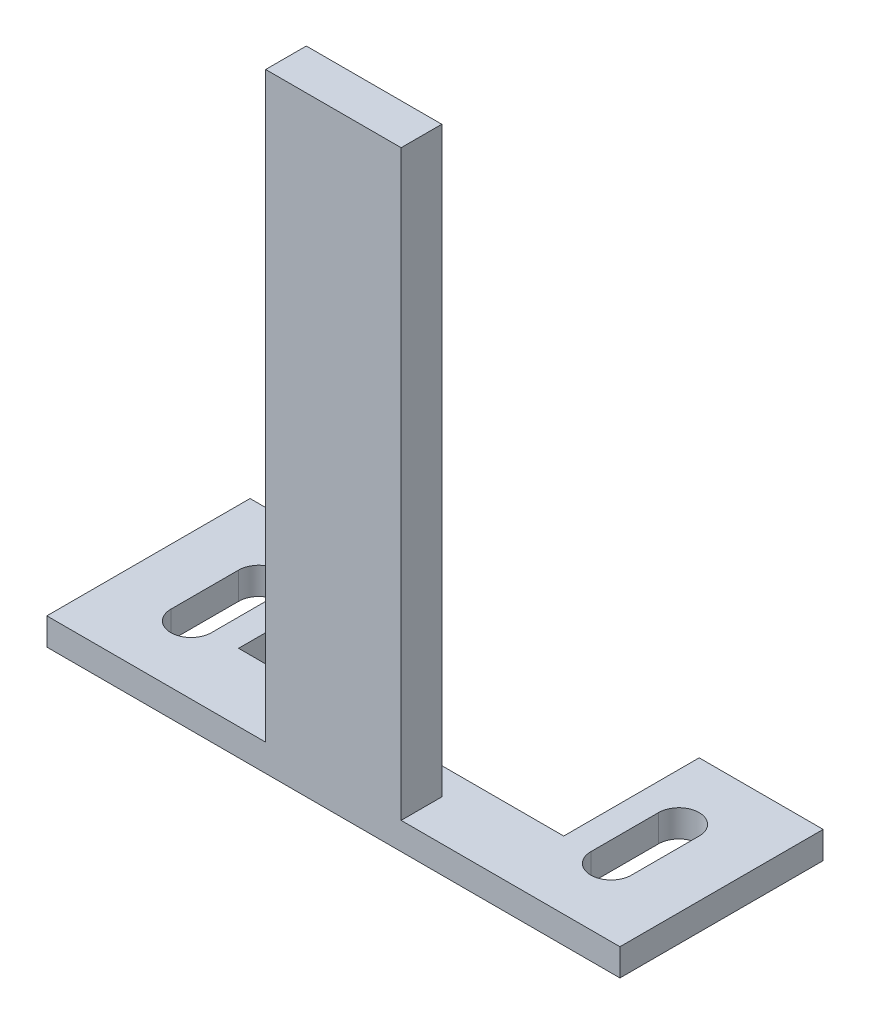
ISO-10303-21;
HEADER;
FILE_DESCRIPTION(('STEP AP214'),'2;1');
FILE_NAME('part.step','',(''),(''),'','','');
FILE_SCHEMA(('AUTOMOTIVE_DESIGN { 1 0 10303 214 1 1 1 1 }'));
ENDSEC;
DATA;
#1=APPLICATION_CONTEXT('core data for automotive mechanical design processes');
#2=APPLICATION_PROTOCOL_DEFINITION('international standard','automotive_design',2000,#1);
#3=PRODUCT_CONTEXT('',#1,'mechanical');
#4=PRODUCT('Part','Part','',(#3));
#5=PRODUCT_RELATED_PRODUCT_CATEGORY('part','',(#4));
#6=PRODUCT_DEFINITION_FORMATION('','',#4);
#7=PRODUCT_DEFINITION_CONTEXT('part definition',#1,'design');
#8=PRODUCT_DEFINITION('design','',#6,#7);
#9=PRODUCT_DEFINITION_SHAPE('','',#8);
#10=(LENGTH_UNIT() NAMED_UNIT(*) SI_UNIT(.MILLI.,.METRE.));
#11=(NAMED_UNIT(*) PLANE_ANGLE_UNIT() SI_UNIT($,.RADIAN.));
#12=(NAMED_UNIT(*) SI_UNIT($,.STERADIAN.) SOLID_ANGLE_UNIT());
#13=UNCERTAINTY_MEASURE_WITH_UNIT(LENGTH_MEASURE(1.E-05),#10,'distance_accuracy_value','');
#14=(GEOMETRIC_REPRESENTATION_CONTEXT(3) GLOBAL_UNCERTAINTY_ASSIGNED_CONTEXT((#13)) GLOBAL_UNIT_ASSIGNED_CONTEXT((#10,
#11,#12)) REPRESENTATION_CONTEXT('',''));
#15=CARTESIAN_POINT('',(0.,0.,0.));
#16=DIRECTION('',(0.,0.,1.));
#17=DIRECTION('',(1.,0.,0.));
#18=AXIS2_PLACEMENT_3D('',#15,#16,#17);
#19=CARTESIAN_POINT('',(0.,2.,0.));
#20=DIRECTION('',(0.,1.,0.));
#21=DIRECTION('',(0.,0.,1.));
#22=AXIS2_PLACEMENT_3D('',#19,#20,#21);
#23=PLANE('',#22);
#24=DIRECTION('',(0.,0.,-1.));
#25=VECTOR('',#24,1.);
#26=CARTESIAN_POINT('',(5.,2.,0.));
#27=LINE('',#26,#25);
#28=CARTESIAN_POINT('',(5.,2.,7.5));
#29=VERTEX_POINT('',#28);
#30=CARTESIAN_POINT('',(5.,2.,4.5));
#31=VERTEX_POINT('',#30);
#32=EDGE_CURVE('E182',#29,#31,#27,.T.);
#33=ORIENTED_EDGE('',*,*,#32,.F.);
#34=DIRECTION('',(1.,0.,0.));
#35=VECTOR('',#34,1.);
#36=CARTESIAN_POINT('',(-21.15,2.,7.5));
#37=LINE('',#36,#35);
#38=CARTESIAN_POINT('',(21.15,2.,7.5));
#39=VERTEX_POINT('',#38);
#40=EDGE_CURVE('E332',#29,#39,#37,.T.);
#41=ORIENTED_EDGE('',*,*,#40,.T.);
#42=DIRECTION('',(0.,0.,-1.));
#43=VECTOR('',#42,1.);
#44=CARTESIAN_POINT('',(21.15,2.,-7.5));
#45=LINE('',#44,#43);
#46=CARTESIAN_POINT('',(21.15,2.,-7.5));
#47=VERTEX_POINT('',#46);
#48=EDGE_CURVE('E309',#39,#47,#45,.T.);
#49=ORIENTED_EDGE('',*,*,#48,.T.);
#50=DIRECTION('',(-1.,0.,0.));
#51=VECTOR('',#50,1.);
#52=CARTESIAN_POINT('',(12.,2.,-7.5));
#53=LINE('',#52,#51);
#54=CARTESIAN_POINT('',(12.,2.,-7.5));
#55=VERTEX_POINT('',#54);
#56=EDGE_CURVE('E313',#47,#55,#53,.T.);
#57=ORIENTED_EDGE('',*,*,#56,.T.);
#58=DIRECTION('',(0.,0.,1.));
#59=VECTOR('',#58,1.);
#60=CARTESIAN_POINT('',(12.,2.,-7.5));
#61=LINE('',#60,#59);
#62=CARTESIAN_POINT('',(12.,2.,2.49999999999999));
#63=VERTEX_POINT('',#62);
#64=EDGE_CURVE('E317',#55,#63,#61,.T.);
#65=ORIENTED_EDGE('',*,*,#64,.T.);
#66=DIRECTION('',(-1.,0.,0.));
#67=VECTOR('',#66,1.);
#68=CARTESIAN_POINT('',(12.,2.,2.49999999999999));
#69=LINE('',#68,#67);
#70=CARTESIAN_POINT('',(-12.,2.,2.49999999999999));
#71=VERTEX_POINT('',#70);
#72=EDGE_CURVE('E320',#63,#71,#69,.T.);
#73=ORIENTED_EDGE('',*,*,#72,.T.);
#74=DIRECTION('',(0.,0.,-1.));
#75=VECTOR('',#74,1.);
#76=CARTESIAN_POINT('',(-12.,2.,2.49999999999999));
#77=LINE('',#76,#75);
#78=CARTESIAN_POINT('',(-12.,2.,-7.5));
#79=VERTEX_POINT('',#78);
#80=EDGE_CURVE('E323',#71,#79,#77,.T.);
#81=ORIENTED_EDGE('',*,*,#80,.T.);
#82=DIRECTION('',(-1.,0.,0.));
#83=VECTOR('',#82,1.);
#84=CARTESIAN_POINT('',(-21.15,2.,-7.5));
#85=LINE('',#84,#83);
#86=CARTESIAN_POINT('',(-21.15,2.,-7.5));
#87=VERTEX_POINT('',#86);
#88=EDGE_CURVE('E326',#79,#87,#85,.T.);
#89=ORIENTED_EDGE('',*,*,#88,.T.);
#90=DIRECTION('',(0.,0.,1.));
#91=VECTOR('',#90,1.);
#92=CARTESIAN_POINT('',(-21.15,2.,-7.5));
#93=LINE('',#92,#91);
#94=CARTESIAN_POINT('',(-21.15,2.,7.5));
#95=VERTEX_POINT('',#94);
#96=EDGE_CURVE('E329',#87,#95,#93,.T.);
#97=ORIENTED_EDGE('',*,*,#96,.T.);
#98=CARTESIAN_POINT('',(-5.,2.,7.5));
#99=VERTEX_POINT('',#98);
#100=EDGE_CURVE('E333',#95,#99,#37,.T.);
#101=ORIENTED_EDGE('',*,*,#100,.T.);
#102=DIRECTION('',(0.,0.,1.));
#103=VECTOR('',#102,1.);
#104=CARTESIAN_POINT('',(-5.,2.,0.));
#105=LINE('',#104,#103);
#106=CARTESIAN_POINT('',(-5.,2.,4.5));
#107=VERTEX_POINT('',#106);
#108=EDGE_CURVE('E60',#107,#99,#105,.T.);
#109=ORIENTED_EDGE('',*,*,#108,.F.);
#110=DIRECTION('',(1.,0.,0.));
#111=VECTOR('',#110,1.);
#112=CARTESIAN_POINT('',(0.,2.,4.5));
#113=LINE('',#112,#111);
#114=EDGE_CURVE('E55',#107,#31,#113,.T.);
#115=ORIENTED_EDGE('',*,*,#114,.T.);
#116=EDGE_LOOP('',(#33,#41,#49,#57,#65,#73,#81,#89,#97,#101,#109,#115));
#117=FACE_BOUND('',#116,.T.);
#118=DIRECTION('',(0.,0.,1.));
#119=VECTOR('',#118,1.);
#120=CARTESIAN_POINT('',(-17.,2.,-2.5));
#121=LINE('',#120,#119);
#122=CARTESIAN_POINT('',(-17.,2.,-2.5));
#123=VERTEX_POINT('',#122);
#124=CARTESIAN_POINT('',(-17.,2.,2.49999999999999));
#125=VERTEX_POINT('',#124);
#126=EDGE_CURVE('E269',#123,#125,#121,.T.);
#127=ORIENTED_EDGE('',*,*,#126,.F.);
#128=CARTESIAN_POINT('',(-15.5,2.,-2.5));
#129=DIRECTION('',(0.,1.,0.));
#130=DIRECTION('',(0.,0.,1.));
#131=AXIS2_PLACEMENT_3D('',#128,#129,#130);
#132=CIRCLE('',#131,1.5);
#133=CARTESIAN_POINT('',(-14.,2.,-2.5));
#134=VERTEX_POINT('',#133);
#135=EDGE_CURVE('E266',#134,#123,#132,.T.);
#136=ORIENTED_EDGE('',*,*,#135,.F.);
#137=DIRECTION('',(0.,0.,-1.));
#138=VECTOR('',#137,1.);
#139=CARTESIAN_POINT('',(-14.,2.,-2.5));
#140=LINE('',#139,#138);
#141=CARTESIAN_POINT('',(-14.,2.,2.49999999999999));
#142=VERTEX_POINT('',#141);
#143=EDGE_CURVE('E277',#142,#134,#140,.T.);
#144=ORIENTED_EDGE('',*,*,#143,.F.);
#145=CARTESIAN_POINT('',(-15.5,2.,2.49999999999999));
#146=DIRECTION('',(0.,1.,0.));
#147=DIRECTION('',(0.,0.,1.));
#148=AXIS2_PLACEMENT_3D('',#145,#146,#147);
#149=CIRCLE('',#148,1.5);
#150=EDGE_CURVE('E273',#125,#142,#149,.T.);
#151=ORIENTED_EDGE('',*,*,#150,.F.);
#152=EDGE_LOOP('',(#127,#136,#144,#151));
#153=FACE_BOUND('',#152,.T.);
#154=DIRECTION('',(0.,0.,1.));
#155=VECTOR('',#154,1.);
#156=CARTESIAN_POINT('',(14.,2.,-2.5));
#157=LINE('',#156,#155);
#158=CARTESIAN_POINT('',(14.,2.,-2.5));
#159=VERTEX_POINT('',#158);
#160=CARTESIAN_POINT('',(14.,2.,2.49999999999999));
#161=VERTEX_POINT('',#160);
#162=EDGE_CURVE('E226',#159,#161,#157,.T.);
#163=ORIENTED_EDGE('',*,*,#162,.F.);
#164=CARTESIAN_POINT('',(15.5,2.,-2.5));
#165=DIRECTION('',(0.,1.,0.));
#166=DIRECTION('',(0.,0.,1.));
#167=AXIS2_PLACEMENT_3D('',#164,#165,#166);
#168=CIRCLE('',#167,1.5);
#169=CARTESIAN_POINT('',(17.,2.,-2.5));
#170=VERTEX_POINT('',#169);
#171=EDGE_CURVE('E223',#170,#159,#168,.T.);
#172=ORIENTED_EDGE('',*,*,#171,.F.);
#173=DIRECTION('',(0.,0.,-1.));
#174=VECTOR('',#173,1.);
#175=CARTESIAN_POINT('',(17.,2.,-2.5));
#176=LINE('',#175,#174);
#177=CARTESIAN_POINT('',(17.,2.,2.49999999999999));
#178=VERTEX_POINT('',#177);
#179=EDGE_CURVE('E234',#178,#170,#176,.T.);
#180=ORIENTED_EDGE('',*,*,#179,.F.);
#181=CARTESIAN_POINT('',(15.5,2.,2.49999999999999));
#182=DIRECTION('',(0.,1.,0.));
#183=DIRECTION('',(0.,0.,1.));
#184=AXIS2_PLACEMENT_3D('',#181,#182,#183);
#185=CIRCLE('',#184,1.5);
#186=EDGE_CURVE('E230',#161,#178,#185,.T.);
#187=ORIENTED_EDGE('',*,*,#186,.F.);
#188=EDGE_LOOP('',(#163,#172,#180,#187));
#189=FACE_BOUND('',#188,.T.);
#190=ADVANCED_FACE('F39',(#117,#153,#189),#23,.T.);
#191=CARTESIAN_POINT('',(0.,0.,0.));
#192=DIRECTION('',(0.,1.,0.));
#193=DIRECTION('',(0.,0.,1.));
#194=AXIS2_PLACEMENT_3D('',#191,#192,#193);
#195=PLANE('',#194);
#196=DIRECTION('',(0.,0.,-1.));
#197=VECTOR('',#196,1.);
#198=CARTESIAN_POINT('',(21.15,0.,-7.5));
#199=LINE('',#198,#197);
#200=CARTESIAN_POINT('',(21.15,0.,7.5));
#201=VERTEX_POINT('',#200);
#202=CARTESIAN_POINT('',(21.15,0.,-7.5));
#203=VERTEX_POINT('',#202);
#204=EDGE_CURVE('E308',#201,#203,#199,.T.);
#205=ORIENTED_EDGE('',*,*,#204,.F.);
#206=DIRECTION('',(1.,0.,0.));
#207=VECTOR('',#206,1.);
#208=CARTESIAN_POINT('',(-21.15,0.,7.5));
#209=LINE('',#208,#207);
#210=CARTESIAN_POINT('',(-21.15,0.,7.5));
#211=VERTEX_POINT('',#210);
#212=EDGE_CURVE('E314',#211,#201,#209,.T.);
#213=ORIENTED_EDGE('',*,*,#212,.F.);
#214=DIRECTION('',(0.,0.,1.));
#215=VECTOR('',#214,1.);
#216=CARTESIAN_POINT('',(-21.15,0.,-7.5));
#217=LINE('',#216,#215);
#218=CARTESIAN_POINT('',(-21.15,0.,-7.5));
#219=VERTEX_POINT('',#218);
#220=EDGE_CURVE('E355',#219,#211,#217,.T.);
#221=ORIENTED_EDGE('',*,*,#220,.F.);
#222=DIRECTION('',(-1.,0.,0.));
#223=VECTOR('',#222,1.);
#224=CARTESIAN_POINT('',(-21.15,0.,-7.5));
#225=LINE('',#224,#223);
#226=CARTESIAN_POINT('',(-12.,0.,-7.5));
#227=VERTEX_POINT('',#226);
#228=EDGE_CURVE('E352',#227,#219,#225,.T.);
#229=ORIENTED_EDGE('',*,*,#228,.F.);
#230=DIRECTION('',(0.,0.,-1.));
#231=VECTOR('',#230,1.);
#232=CARTESIAN_POINT('',(-12.,0.,2.49999999999999));
#233=LINE('',#232,#231);
#234=CARTESIAN_POINT('',(-12.,0.,2.49999999999999));
#235=VERTEX_POINT('',#234);
#236=EDGE_CURVE('E349',#235,#227,#233,.T.);
#237=ORIENTED_EDGE('',*,*,#236,.F.);
#238=DIRECTION('',(-1.,0.,0.));
#239=VECTOR('',#238,1.);
#240=CARTESIAN_POINT('',(12.,0.,2.49999999999999));
#241=LINE('',#240,#239);
#242=CARTESIAN_POINT('',(12.,0.,2.49999999999999));
#243=VERTEX_POINT('',#242);
#244=EDGE_CURVE('E346',#243,#235,#241,.T.);
#245=ORIENTED_EDGE('',*,*,#244,.F.);
#246=DIRECTION('',(0.,0.,1.));
#247=VECTOR('',#246,1.);
#248=CARTESIAN_POINT('',(12.,0.,-7.5));
#249=LINE('',#248,#247);
#250=CARTESIAN_POINT('',(12.,0.,-7.5));
#251=VERTEX_POINT('',#250);
#252=EDGE_CURVE('E343',#251,#243,#249,.T.);
#253=ORIENTED_EDGE('',*,*,#252,.F.);
#254=DIRECTION('',(-1.,0.,0.));
#255=VECTOR('',#254,1.);
#256=CARTESIAN_POINT('',(12.,0.,-7.5));
#257=LINE('',#256,#255);
#258=EDGE_CURVE('E340',#203,#251,#257,.T.);
#259=ORIENTED_EDGE('',*,*,#258,.F.);
#260=EDGE_LOOP('',(#205,#213,#221,#229,#237,#245,#253,#259));
#261=FACE_BOUND('',#260,.T.);
#262=CARTESIAN_POINT('',(-15.5,0.,-2.5));
#263=DIRECTION('',(0.,1.,0.));
#264=DIRECTION('',(0.,0.,1.));
#265=AXIS2_PLACEMENT_3D('',#262,#263,#264);
#266=CIRCLE('',#265,1.5);
#267=CARTESIAN_POINT('',(-14.,0.,-2.5));
#268=VERTEX_POINT('',#267);
#269=CARTESIAN_POINT('',(-17.,0.,-2.5));
#270=VERTEX_POINT('',#269);
#271=EDGE_CURVE('E265',#268,#270,#266,.T.);
#272=ORIENTED_EDGE('',*,*,#271,.T.);
#273=DIRECTION('',(0.,0.,1.));
#274=VECTOR('',#273,1.);
#275=CARTESIAN_POINT('',(-17.,0.,-2.5));
#276=LINE('',#275,#274);
#277=CARTESIAN_POINT('',(-17.,0.,2.49999999999999));
#278=VERTEX_POINT('',#277);
#279=EDGE_CURVE('E284',#270,#278,#276,.T.);
#280=ORIENTED_EDGE('',*,*,#279,.T.);
#281=CARTESIAN_POINT('',(-15.5,0.,2.49999999999999));
#282=DIRECTION('',(0.,1.,0.));
#283=DIRECTION('',(0.,0.,1.));
#284=AXIS2_PLACEMENT_3D('',#281,#282,#283);
#285=CIRCLE('',#284,1.5);
#286=CARTESIAN_POINT('',(-14.,0.,2.49999999999999));
#287=VERTEX_POINT('',#286);
#288=EDGE_CURVE('E288',#278,#287,#285,.T.);
#289=ORIENTED_EDGE('',*,*,#288,.T.);
#290=DIRECTION('',(0.,0.,-1.));
#291=VECTOR('',#290,1.);
#292=CARTESIAN_POINT('',(-14.,0.,-2.5));
#293=LINE('',#292,#291);
#294=EDGE_CURVE('E270',#287,#268,#293,.T.);
#295=ORIENTED_EDGE('',*,*,#294,.T.);
#296=EDGE_LOOP('',(#272,#280,#289,#295));
#297=FACE_BOUND('',#296,.T.);
#298=CARTESIAN_POINT('',(15.5,0.,-2.5));
#299=DIRECTION('',(0.,1.,0.));
#300=DIRECTION('',(0.,0.,1.));
#301=AXIS2_PLACEMENT_3D('',#298,#299,#300);
#302=CIRCLE('',#301,1.5);
#303=CARTESIAN_POINT('',(17.,0.,-2.5));
#304=VERTEX_POINT('',#303);
#305=CARTESIAN_POINT('',(14.,0.,-2.5));
#306=VERTEX_POINT('',#305);
#307=EDGE_CURVE('E222',#304,#306,#302,.T.);
#308=ORIENTED_EDGE('',*,*,#307,.T.);
#309=DIRECTION('',(0.,0.,1.));
#310=VECTOR('',#309,1.);
#311=CARTESIAN_POINT('',(14.,0.,-2.5));
#312=LINE('',#311,#310);
#313=CARTESIAN_POINT('',(14.,0.,2.49999999999999));
#314=VERTEX_POINT('',#313);
#315=EDGE_CURVE('E241',#306,#314,#312,.T.);
#316=ORIENTED_EDGE('',*,*,#315,.T.);
#317=CARTESIAN_POINT('',(15.5,0.,2.49999999999999));
#318=DIRECTION('',(0.,1.,0.));
#319=DIRECTION('',(0.,0.,1.));
#320=AXIS2_PLACEMENT_3D('',#317,#318,#319);
#321=CIRCLE('',#320,1.5);
#322=CARTESIAN_POINT('',(17.,0.,2.49999999999999));
#323=VERTEX_POINT('',#322);
#324=EDGE_CURVE('E245',#314,#323,#321,.T.);
#325=ORIENTED_EDGE('',*,*,#324,.T.);
#326=DIRECTION('',(0.,0.,-1.));
#327=VECTOR('',#326,1.);
#328=CARTESIAN_POINT('',(17.,0.,-2.5));
#329=LINE('',#328,#327);
#330=EDGE_CURVE('E227',#323,#304,#329,.T.);
#331=ORIENTED_EDGE('',*,*,#330,.T.);
#332=EDGE_LOOP('',(#308,#316,#325,#331));
#333=FACE_BOUND('',#332,.T.);
#334=ADVANCED_FACE('F394',(#261,#297,#333),#195,.F.);
#335=CARTESIAN_POINT('',(21.15,2.,-7.5));
#336=DIRECTION('',(-1.,0.,0.));
#337=DIRECTION('',(0.,0.,1.));
#338=AXIS2_PLACEMENT_3D('',#335,#336,#337);
#339=PLANE('',#338);
#340=ORIENTED_EDGE('',*,*,#204,.T.);
#341=DIRECTION('',(0.,-1.,0.));
#342=VECTOR('',#341,1.);
#343=CARTESIAN_POINT('',(21.15,2.,-7.5));
#344=LINE('',#343,#342);
#345=EDGE_CURVE('E11',#47,#203,#344,.T.);
#346=ORIENTED_EDGE('',*,*,#345,.F.);
#347=ORIENTED_EDGE('',*,*,#48,.F.);
#348=DIRECTION('',(0.,-1.,0.));
#349=VECTOR('',#348,1.);
#350=CARTESIAN_POINT('',(21.15,2.,7.5));
#351=LINE('',#350,#349);
#352=EDGE_CURVE('E336',#39,#201,#351,.T.);
#353=ORIENTED_EDGE('',*,*,#352,.T.);
#354=EDGE_LOOP('',(#340,#346,#347,#353));
#355=FACE_BOUND('',#354,.T.);
#356=ADVANCED_FACE('F41',(#355),#339,.F.);
#357=CARTESIAN_POINT('',(12.,2.,-7.5));
#358=DIRECTION('',(0.,0.,1.));
#359=DIRECTION('',(1.,0.,0.));
#360=AXIS2_PLACEMENT_3D('',#357,#358,#359);
#361=PLANE('',#360);
#362=ORIENTED_EDGE('',*,*,#258,.T.);
#363=DIRECTION('',(0.,-1.,0.));
#364=VECTOR('',#363,1.);
#365=CARTESIAN_POINT('',(12.,2.,-7.5));
#366=LINE('',#365,#364);
#367=EDGE_CURVE('E48',#55,#251,#366,.T.);
#368=ORIENTED_EDGE('',*,*,#367,.F.);
#369=ORIENTED_EDGE('',*,*,#56,.F.);
#370=ORIENTED_EDGE('',*,*,#345,.T.);
#371=EDGE_LOOP('',(#362,#368,#369,#370));
#372=FACE_BOUND('',#371,.T.);
#373=ADVANCED_FACE('F411',(#372),#361,.F.);
#374=CARTESIAN_POINT('',(12.,2.,-7.5));
#375=DIRECTION('',(1.,0.,0.));
#376=DIRECTION('',(0.,0.,-1.));
#377=AXIS2_PLACEMENT_3D('',#374,#375,#376);
#378=PLANE('',#377);
#379=ORIENTED_EDGE('',*,*,#252,.T.);
#380=DIRECTION('',(0.,-1.,0.));
#381=VECTOR('',#380,1.);
#382=CARTESIAN_POINT('',(12.,2.,2.49999999999999));
#383=LINE('',#382,#381);
#384=EDGE_CURVE('E379',#63,#243,#383,.T.);
#385=ORIENTED_EDGE('',*,*,#384,.F.);
#386=ORIENTED_EDGE('',*,*,#64,.F.);
#387=ORIENTED_EDGE('',*,*,#367,.T.);
#388=EDGE_LOOP('',(#379,#385,#386,#387));
#389=FACE_BOUND('',#388,.T.);
#390=ADVANCED_FACE('F388',(#389),#378,.F.);
#391=CARTESIAN_POINT('',(12.,2.,2.49999999999999));
#392=DIRECTION('',(0.,0.,1.));
#393=DIRECTION('',(1.,0.,0.));
#394=AXIS2_PLACEMENT_3D('',#391,#392,#393);
#395=PLANE('',#394);
#396=ORIENTED_EDGE('',*,*,#244,.T.);
#397=DIRECTION('',(0.,-1.,0.));
#398=VECTOR('',#397,1.);
#399=CARTESIAN_POINT('',(-12.,2.,2.49999999999999));
#400=LINE('',#399,#398);
#401=EDGE_CURVE('E375',#71,#235,#400,.T.);
#402=ORIENTED_EDGE('',*,*,#401,.F.);
#403=ORIENTED_EDGE('',*,*,#72,.F.);
#404=ORIENTED_EDGE('',*,*,#384,.T.);
#405=EDGE_LOOP('',(#396,#402,#403,#404));
#406=FACE_BOUND('',#405,.T.);
#407=ADVANCED_FACE('F400',(#406),#395,.F.);
#408=CARTESIAN_POINT('',(-12.,2.,2.49999999999999));
#409=DIRECTION('',(-1.,0.,0.));
#410=DIRECTION('',(0.,0.,1.));
#411=AXIS2_PLACEMENT_3D('',#408,#409,#410);
#412=PLANE('',#411);
#413=ORIENTED_EDGE('',*,*,#236,.T.);
#414=DIRECTION('',(0.,-1.,0.));
#415=VECTOR('',#414,1.);
#416=CARTESIAN_POINT('',(-12.,2.,-7.5));
#417=LINE('',#416,#415);
#418=EDGE_CURVE('E371',#79,#227,#417,.T.);
#419=ORIENTED_EDGE('',*,*,#418,.F.);
#420=ORIENTED_EDGE('',*,*,#80,.F.);
#421=ORIENTED_EDGE('',*,*,#401,.T.);
#422=EDGE_LOOP('',(#413,#419,#420,#421));
#423=FACE_BOUND('',#422,.T.);
#424=ADVANCED_FACE('F404',(#423),#412,.F.);
#425=CARTESIAN_POINT('',(-21.15,2.,-7.5));
#426=DIRECTION('',(0.,0.,1.));
#427=DIRECTION('',(1.,0.,0.));
#428=AXIS2_PLACEMENT_3D('',#425,#426,#427);
#429=PLANE('',#428);
#430=ORIENTED_EDGE('',*,*,#228,.T.);
#431=DIRECTION('',(0.,-1.,0.));
#432=VECTOR('',#431,1.);
#433=CARTESIAN_POINT('',(-21.15,2.,-7.5));
#434=LINE('',#433,#432);
#435=EDGE_CURVE('E367',#87,#219,#434,.T.);
#436=ORIENTED_EDGE('',*,*,#435,.F.);
#437=ORIENTED_EDGE('',*,*,#88,.F.);
#438=ORIENTED_EDGE('',*,*,#418,.T.);
#439=EDGE_LOOP('',(#430,#436,#437,#438));
#440=FACE_BOUND('',#439,.T.);
#441=ADVANCED_FACE('F424',(#440),#429,.F.);
#442=CARTESIAN_POINT('',(-21.15,2.,-7.5));
#443=DIRECTION('',(1.,0.,0.));
#444=DIRECTION('',(0.,0.,-1.));
#445=AXIS2_PLACEMENT_3D('',#442,#443,#444);
#446=PLANE('',#445);
#447=ORIENTED_EDGE('',*,*,#220,.T.);
#448=DIRECTION('',(0.,-1.,0.));
#449=VECTOR('',#448,1.);
#450=CARTESIAN_POINT('',(-21.15,2.,7.5));
#451=LINE('',#450,#449);
#452=EDGE_CURVE('E363',#95,#211,#451,.T.);
#453=ORIENTED_EDGE('',*,*,#452,.F.);
#454=ORIENTED_EDGE('',*,*,#96,.F.);
#455=ORIENTED_EDGE('',*,*,#435,.T.);
#456=EDGE_LOOP('',(#447,#453,#454,#455));
#457=FACE_BOUND('',#456,.T.);
#458=ADVANCED_FACE('F422',(#457),#446,.F.);
#459=CARTESIAN_POINT('',(-21.15,2.,7.5));
#460=DIRECTION('',(0.,0.,-1.));
#461=DIRECTION('',(-1.,0.,0.));
#462=AXIS2_PLACEMENT_3D('',#459,#460,#461);
#463=PLANE('',#462);
#464=ORIENTED_EDGE('',*,*,#212,.T.);
#465=ORIENTED_EDGE('',*,*,#352,.F.);
#466=ORIENTED_EDGE('',*,*,#40,.F.);
#467=DIRECTION('',(0.,1.,0.));
#468=VECTOR('',#467,1.);
#469=CARTESIAN_POINT('',(5.,0.,7.5));
#470=LINE('',#469,#468);
#471=CARTESIAN_POINT('',(4.99999999999999,45.,7.5));
#472=VERTEX_POINT('',#471);
#473=EDGE_CURVE('E206',#29,#472,#470,.T.);
#474=ORIENTED_EDGE('',*,*,#473,.T.);
#475=DIRECTION('',(-1.,0.,0.));
#476=VECTOR('',#475,1.);
#477=CARTESIAN_POINT('',(4.99999999999999,45.,7.5));
#478=LINE('',#477,#476);
#479=CARTESIAN_POINT('',(-5.,45.,7.5));
#480=VERTEX_POINT('',#479);
#481=EDGE_CURVE('E193',#472,#480,#478,.T.);
#482=ORIENTED_EDGE('',*,*,#481,.T.);
#483=DIRECTION('',(0.,-1.,0.));
#484=VECTOR('',#483,1.);
#485=CARTESIAN_POINT('',(-5.,0.,7.5));
#486=LINE('',#485,#484);
#487=EDGE_CURVE('E187',#480,#99,#486,.T.);
#488=ORIENTED_EDGE('',*,*,#487,.T.);
#489=ORIENTED_EDGE('',*,*,#100,.F.);
#490=ORIENTED_EDGE('',*,*,#452,.T.);
#491=EDGE_LOOP('',(#464,#465,#466,#474,#482,#488,#489,#490));
#492=FACE_BOUND('',#491,.T.);
#493=ADVANCED_FACE('F417',(#492),#463,.F.);
#494=CARTESIAN_POINT('',(-15.5,2.,-2.5));
#495=DIRECTION('',(0.,-1.,0.));
#496=DIRECTION('',(0.,0.,-1.));
#497=AXIS2_PLACEMENT_3D('',#494,#495,#496);
#498=CYLINDRICAL_SURFACE('',#497,1.5);
#499=ORIENTED_EDGE('',*,*,#271,.F.);
#500=DIRECTION('',(0.,-1.,0.));
#501=VECTOR('',#500,1.);
#502=CARTESIAN_POINT('',(-14.,2.,-2.5));
#503=LINE('',#502,#501);
#504=EDGE_CURVE('E280',#134,#268,#503,.T.);
#505=ORIENTED_EDGE('',*,*,#504,.F.);
#506=ORIENTED_EDGE('',*,*,#135,.T.);
#507=DIRECTION('',(0.,-1.,0.));
#508=VECTOR('',#507,1.);
#509=CARTESIAN_POINT('',(-17.,2.,-2.5));
#510=LINE('',#509,#508);
#511=EDGE_CURVE('E304',#123,#270,#510,.T.);
#512=ORIENTED_EDGE('',*,*,#511,.T.);
#513=EDGE_LOOP('',(#499,#505,#506,#512));
#514=FACE_BOUND('',#513,.T.);
#515=ADVANCED_FACE('F440',(#514),#498,.F.);
#516=CARTESIAN_POINT('',(-17.,2.,-2.5));
#517=DIRECTION('',(1.,0.,0.));
#518=DIRECTION('',(0.,0.,-1.));
#519=AXIS2_PLACEMENT_3D('',#516,#517,#518);
#520=PLANE('',#519);
#521=ORIENTED_EDGE('',*,*,#279,.F.);
#522=ORIENTED_EDGE('',*,*,#511,.F.);
#523=ORIENTED_EDGE('',*,*,#126,.T.);
#524=DIRECTION('',(0.,-1.,0.));
#525=VECTOR('',#524,1.);
#526=CARTESIAN_POINT('',(-17.,2.,2.49999999999999));
#527=LINE('',#526,#525);
#528=EDGE_CURVE('E301',#125,#278,#527,.T.);
#529=ORIENTED_EDGE('',*,*,#528,.T.);
#530=EDGE_LOOP('',(#521,#522,#523,#529));
#531=FACE_BOUND('',#530,.T.);
#532=ADVANCED_FACE('F447',(#531),#520,.T.);
#533=CARTESIAN_POINT('',(-15.5,2.,2.49999999999999));
#534=DIRECTION('',(0.,-1.,0.));
#535=DIRECTION('',(0.,0.,-1.));
#536=AXIS2_PLACEMENT_3D('',#533,#534,#535);
#537=CYLINDRICAL_SURFACE('',#536,1.5);
#538=ORIENTED_EDGE('',*,*,#288,.F.);
#539=ORIENTED_EDGE('',*,*,#528,.F.);
#540=ORIENTED_EDGE('',*,*,#150,.T.);
#541=DIRECTION('',(0.,-1.,0.));
#542=VECTOR('',#541,1.);
#543=CARTESIAN_POINT('',(-14.,2.,2.49999999999999));
#544=LINE('',#543,#542);
#545=EDGE_CURVE('E298',#142,#287,#544,.T.);
#546=ORIENTED_EDGE('',*,*,#545,.T.);
#547=EDGE_LOOP('',(#538,#539,#540,#546));
#548=FACE_BOUND('',#547,.T.);
#549=ADVANCED_FACE('F452',(#548),#537,.F.);
#550=CARTESIAN_POINT('',(-14.,2.,-2.5));
#551=DIRECTION('',(-1.,0.,0.));
#552=DIRECTION('',(0.,0.,1.));
#553=AXIS2_PLACEMENT_3D('',#550,#551,#552);
#554=PLANE('',#553);
#555=ORIENTED_EDGE('',*,*,#294,.F.);
#556=ORIENTED_EDGE('',*,*,#545,.F.);
#557=ORIENTED_EDGE('',*,*,#143,.T.);
#558=ORIENTED_EDGE('',*,*,#504,.T.);
#559=EDGE_LOOP('',(#555,#556,#557,#558));
#560=FACE_BOUND('',#559,.T.);
#561=ADVANCED_FACE('F459',(#560),#554,.T.);
#562=CARTESIAN_POINT('',(15.5,2.,-2.5));
#563=DIRECTION('',(0.,-1.,0.));
#564=DIRECTION('',(0.,0.,-1.));
#565=AXIS2_PLACEMENT_3D('',#562,#563,#564);
#566=CYLINDRICAL_SURFACE('',#565,1.5);
#567=ORIENTED_EDGE('',*,*,#307,.F.);
#568=DIRECTION('',(0.,-1.,0.));
#569=VECTOR('',#568,1.);
#570=CARTESIAN_POINT('',(17.,2.,-2.5));
#571=LINE('',#570,#569);
#572=EDGE_CURVE('E237',#170,#304,#571,.T.);
#573=ORIENTED_EDGE('',*,*,#572,.F.);
#574=ORIENTED_EDGE('',*,*,#171,.T.);
#575=DIRECTION('',(0.,-1.,0.));
#576=VECTOR('',#575,1.);
#577=CARTESIAN_POINT('',(14.,2.,-2.5));
#578=LINE('',#577,#576);
#579=EDGE_CURVE('E261',#159,#306,#578,.T.);
#580=ORIENTED_EDGE('',*,*,#579,.T.);
#581=EDGE_LOOP('',(#567,#573,#574,#580));
#582=FACE_BOUND('',#581,.T.);
#583=ADVANCED_FACE('F481',(#582),#566,.F.);
#584=CARTESIAN_POINT('',(14.,2.,-2.5));
#585=DIRECTION('',(1.,0.,0.));
#586=DIRECTION('',(0.,0.,-1.));
#587=AXIS2_PLACEMENT_3D('',#584,#585,#586);
#588=PLANE('',#587);
#589=ORIENTED_EDGE('',*,*,#315,.F.);
#590=ORIENTED_EDGE('',*,*,#579,.F.);
#591=ORIENTED_EDGE('',*,*,#162,.T.);
#592=DIRECTION('',(0.,-1.,0.));
#593=VECTOR('',#592,1.);
#594=CARTESIAN_POINT('',(14.,2.,2.49999999999999));
#595=LINE('',#594,#593);
#596=EDGE_CURVE('E258',#161,#314,#595,.T.);
#597=ORIENTED_EDGE('',*,*,#596,.T.);
#598=EDGE_LOOP('',(#589,#590,#591,#597));
#599=FACE_BOUND('',#598,.T.);
#600=ADVANCED_FACE('F475',(#599),#588,.T.);
#601=CARTESIAN_POINT('',(15.5,2.,2.49999999999999));
#602=DIRECTION('',(0.,-1.,0.));
#603=DIRECTION('',(0.,0.,-1.));
#604=AXIS2_PLACEMENT_3D('',#601,#602,#603);
#605=CYLINDRICAL_SURFACE('',#604,1.5);
#606=ORIENTED_EDGE('',*,*,#324,.F.);
#607=ORIENTED_EDGE('',*,*,#596,.F.);
#608=ORIENTED_EDGE('',*,*,#186,.T.);
#609=DIRECTION('',(0.,-1.,0.));
#610=VECTOR('',#609,1.);
#611=CARTESIAN_POINT('',(17.,2.,2.49999999999999));
#612=LINE('',#611,#610);
#613=EDGE_CURVE('E255',#178,#323,#612,.T.);
#614=ORIENTED_EDGE('',*,*,#613,.T.);
#615=EDGE_LOOP('',(#606,#607,#608,#614));
#616=FACE_BOUND('',#615,.T.);
#617=ADVANCED_FACE('F478',(#616),#605,.F.);
#618=CARTESIAN_POINT('',(17.,2.,-2.5));
#619=DIRECTION('',(-1.,0.,0.));
#620=DIRECTION('',(0.,0.,1.));
#621=AXIS2_PLACEMENT_3D('',#618,#619,#620);
#622=PLANE('',#621);
#623=ORIENTED_EDGE('',*,*,#330,.F.);
#624=ORIENTED_EDGE('',*,*,#613,.F.);
#625=ORIENTED_EDGE('',*,*,#179,.T.);
#626=ORIENTED_EDGE('',*,*,#572,.T.);
#627=EDGE_LOOP('',(#623,#624,#625,#626));
#628=FACE_BOUND('',#627,.T.);
#629=ADVANCED_FACE('F484',(#628),#622,.T.);
#630=CARTESIAN_POINT('',(5.,0.,4.5));
#631=DIRECTION('',(1.,0.,0.));
#632=DIRECTION('',(0.,1.,0.));
#633=AXIS2_PLACEMENT_3D('',#630,#631,#632);
#634=PLANE('',#633);
#635=ORIENTED_EDGE('',*,*,#473,.F.);
#636=ORIENTED_EDGE('',*,*,#32,.T.);
#637=DIRECTION('',(0.,1.,0.));
#638=VECTOR('',#637,1.);
#639=CARTESIAN_POINT('',(5.,0.,4.5));
#640=LINE('',#639,#638);
#641=CARTESIAN_POINT('',(4.99999999999999,45.,4.5));
#642=VERTEX_POINT('',#641);
#643=EDGE_CURVE('E176',#31,#642,#640,.T.);
#644=ORIENTED_EDGE('',*,*,#643,.T.);
#645=DIRECTION('',(0.,0.,1.));
#646=VECTOR('',#645,1.);
#647=CARTESIAN_POINT('',(4.99999999999999,45.,4.5));
#648=LINE('',#647,#646);
#649=EDGE_CURVE('E180',#642,#472,#648,.T.);
#650=ORIENTED_EDGE('',*,*,#649,.T.);
#651=EDGE_LOOP('',(#635,#636,#644,#650));
#652=FACE_BOUND('',#651,.T.);
#653=ADVANCED_FACE('F179',(#652),#634,.T.);
#654=CARTESIAN_POINT('',(-5.,0.,4.5));
#655=DIRECTION('',(-1.,0.,0.));
#656=DIRECTION('',(0.,-1.,0.));
#657=AXIS2_PLACEMENT_3D('',#654,#655,#656);
#658=PLANE('',#657);
#659=DIRECTION('',(0.,-1.,0.));
#660=VECTOR('',#659,1.);
#661=CARTESIAN_POINT('',(-5.,0.,4.5));
#662=LINE('',#661,#660);
#663=CARTESIAN_POINT('',(-5.,45.,4.5));
#664=VERTEX_POINT('',#663);
#665=EDGE_CURVE('E196',#664,#107,#662,.T.);
#666=ORIENTED_EDGE('',*,*,#665,.T.);
#667=ORIENTED_EDGE('',*,*,#108,.T.);
#668=ORIENTED_EDGE('',*,*,#487,.F.);
#669=DIRECTION('',(0.,0.,1.));
#670=VECTOR('',#669,1.);
#671=CARTESIAN_POINT('',(-5.,45.,4.5));
#672=LINE('',#671,#670);
#673=EDGE_CURVE('E195',#664,#480,#672,.T.);
#674=ORIENTED_EDGE('',*,*,#673,.F.);
#675=EDGE_LOOP('',(#666,#667,#668,#674));
#676=FACE_BOUND('',#675,.T.);
#677=ADVANCED_FACE('F491',(#676),#658,.T.);
#678=CARTESIAN_POINT('',(4.99999999999999,45.,4.5));
#679=DIRECTION('',(0.,1.,0.));
#680=DIRECTION('',(0.,0.,1.));
#681=AXIS2_PLACEMENT_3D('',#678,#679,#680);
#682=PLANE('',#681);
#683=ORIENTED_EDGE('',*,*,#481,.F.);
#684=ORIENTED_EDGE('',*,*,#649,.F.);
#685=DIRECTION('',(-1.,0.,0.));
#686=VECTOR('',#685,1.);
#687=CARTESIAN_POINT('',(4.99999999999999,45.,4.5));
#688=LINE('',#687,#686);
#689=EDGE_CURVE('E186',#642,#664,#688,.T.);
#690=ORIENTED_EDGE('',*,*,#689,.T.);
#691=ORIENTED_EDGE('',*,*,#673,.T.);
#692=EDGE_LOOP('',(#683,#684,#690,#691));
#693=FACE_BOUND('',#692,.T.);
#694=ADVANCED_FACE('F191',(#693),#682,.T.);
#695=CARTESIAN_POINT('',(0.,0.,4.5));
#696=DIRECTION('',(0.,0.,1.));
#697=DIRECTION('',(1.,0.,0.));
#698=AXIS2_PLACEMENT_3D('',#695,#696,#697);
#699=PLANE('',#698);
#700=ORIENTED_EDGE('',*,*,#114,.F.);
#701=ORIENTED_EDGE('',*,*,#665,.F.);
#702=ORIENTED_EDGE('',*,*,#689,.F.);
#703=ORIENTED_EDGE('',*,*,#643,.F.);
#704=EDGE_LOOP('',(#700,#701,#702,#703));
#705=FACE_BOUND('',#704,.T.);
#706=ADVANCED_FACE('F199',(#705),#699,.F.);
#707=CLOSED_SHELL('',(#190,#334,#356,#373,#390,#407,#424,#441,#458,#493,#515,#532,#549,#561,
#583,#600,#617,#629,#653,#677,#694,#706));
#708=MANIFOLD_SOLID_BREP('B2',#707);
#709=ADVANCED_BREP_SHAPE_REPRESENTATION('',(#18,#708),#14);
#710=SHAPE_DEFINITION_REPRESENTATION(#9,#709);
ENDSEC;
END-ISO-10303-21;
